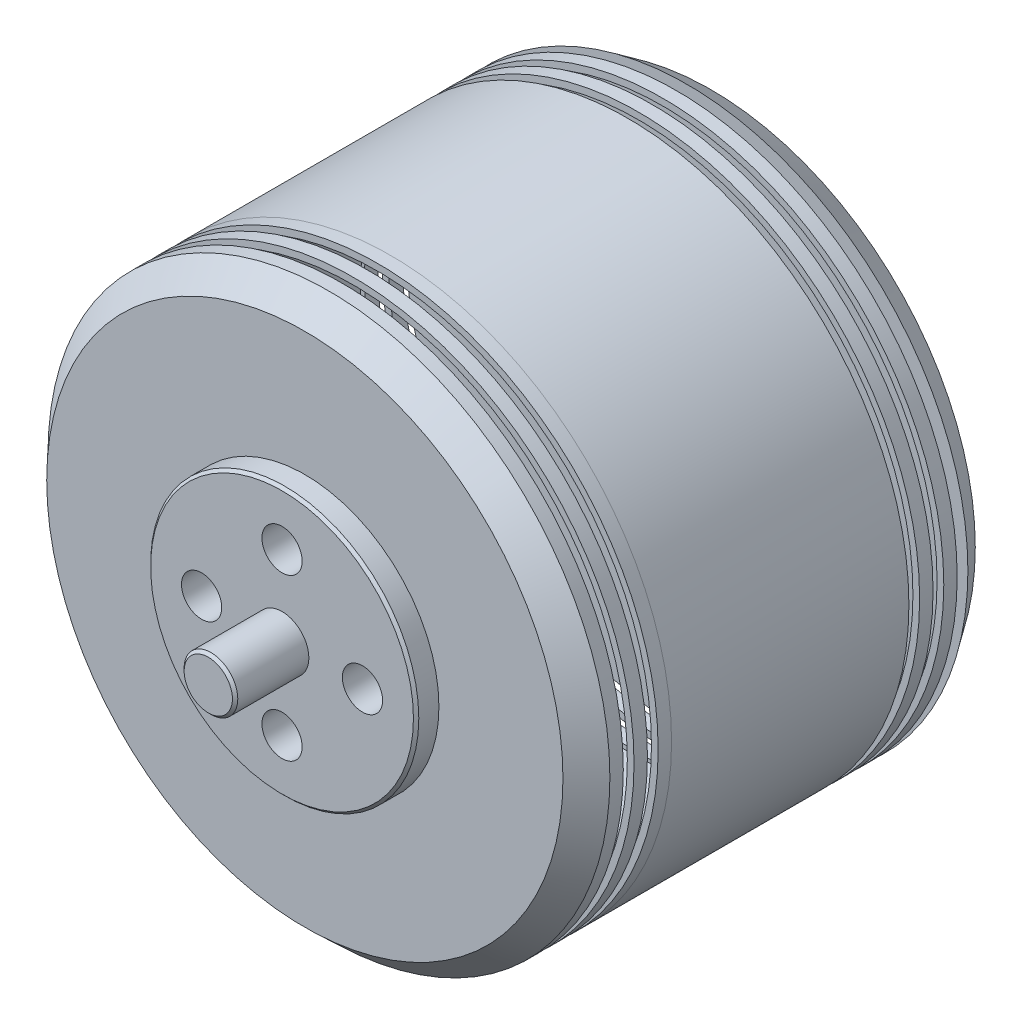
ISO-10303-21;
HEADER;
FILE_DESCRIPTION(('STEP AP214'),'2;1');
FILE_NAME('part.step','',(''),(''),'','','');
FILE_SCHEMA(('AUTOMOTIVE_DESIGN { 1 0 10303 214 1 1 1 1 }'));
ENDSEC;
DATA;
#1=APPLICATION_CONTEXT('core data for automotive mechanical design processes');
#2=APPLICATION_PROTOCOL_DEFINITION('international standard','automotive_design',2000,#1);
#3=PRODUCT_CONTEXT('',#1,'mechanical');
#4=PRODUCT('Part','Part','',(#3));
#5=PRODUCT_RELATED_PRODUCT_CATEGORY('part','',(#4));
#6=PRODUCT_DEFINITION_FORMATION('','',#4);
#7=PRODUCT_DEFINITION_CONTEXT('part definition',#1,'design');
#8=PRODUCT_DEFINITION('design','',#6,#7);
#9=PRODUCT_DEFINITION_SHAPE('','',#8);
#10=(LENGTH_UNIT() NAMED_UNIT(*) SI_UNIT(.MILLI.,.METRE.));
#11=(NAMED_UNIT(*) PLANE_ANGLE_UNIT() SI_UNIT($,.RADIAN.));
#12=(NAMED_UNIT(*) SI_UNIT($,.STERADIAN.) SOLID_ANGLE_UNIT());
#13=UNCERTAINTY_MEASURE_WITH_UNIT(LENGTH_MEASURE(1.E-05),#10,'distance_accuracy_value','');
#14=(GEOMETRIC_REPRESENTATION_CONTEXT(3) GLOBAL_UNCERTAINTY_ASSIGNED_CONTEXT((#13)) GLOBAL_UNIT_ASSIGNED_CONTEXT((#10,
#11,#12)) REPRESENTATION_CONTEXT('',''));
#15=CARTESIAN_POINT('',(0.,0.,0.));
#16=DIRECTION('',(0.,0.,1.));
#17=DIRECTION('',(1.,0.,0.));
#18=AXIS2_PLACEMENT_3D('',#15,#16,#17);
#19=CARTESIAN_POINT('',(0.,0.,27.5));
#20=DIRECTION('',(0.,0.,1.));
#21=DIRECTION('',(1.,0.,0.));
#22=AXIS2_PLACEMENT_3D('',#19,#20,#21);
#23=PLANE('',#22);
#24=CARTESIAN_POINT('',(0.,0.,27.5));
#25=DIRECTION('',(0.,0.,1.));
#26=DIRECTION('',(1.,0.,0.));
#27=AXIS2_PLACEMENT_3D('',#24,#25,#26);
#28=CIRCLE('',#27,20.95);
#29=CARTESIAN_POINT('',(20.95,0.,27.5));
#30=VERTEX_POINT('',#29);
#31=EDGE_CURVE('E84',#30,#30,#28,.T.);
#32=ORIENTED_EDGE('',*,*,#31,.F.);
#33=EDGE_LOOP('',(#32));
#34=FACE_BOUND('',#33,.T.);
#35=CARTESIAN_POINT('',(0.,0.,27.5));
#36=DIRECTION('',(0.,0.,1.));
#37=DIRECTION('',(1.,0.,0.));
#38=AXIS2_PLACEMENT_3D('',#35,#36,#37);
#39=CIRCLE('',#38,20.45);
#40=CARTESIAN_POINT('',(20.45,0.,27.5));
#41=VERTEX_POINT('',#40);
#42=EDGE_CURVE('E87',#41,#41,#39,.T.);
#43=ORIENTED_EDGE('',*,*,#42,.T.);
#44=EDGE_LOOP('',(#43));
#45=FACE_BOUND('',#44,.T.);
#46=ADVANCED_FACE('F52',(#34,#45),#23,.F.);
#47=CARTESIAN_POINT('',(0.,0.,28.5));
#48=DIRECTION('',(0.,0.,-1.));
#49=DIRECTION('',(-1.,0.,0.));
#50=AXIS2_PLACEMENT_3D('',#47,#48,#49);
#51=CYLINDRICAL_SURFACE('',#50,20.95);
#52=CARTESIAN_POINT('',(0.,0.,28.5));
#53=DIRECTION('',(0.,0.,-1.));
#54=DIRECTION('',(-1.,0.,0.));
#55=AXIS2_PLACEMENT_3D('',#52,#53,#54);
#56=CIRCLE('',#55,20.95);
#57=CARTESIAN_POINT('',(-20.95,0.,28.5));
#58=VERTEX_POINT('',#57);
#59=EDGE_CURVE('E80',#58,#58,#56,.F.);
#60=ORIENTED_EDGE('',*,*,#59,.F.);
#61=EDGE_LOOP('',(#60));
#62=FACE_BOUND('',#61,.T.);
#63=ORIENTED_EDGE('',*,*,#31,.T.);
#64=EDGE_LOOP('',(#63));
#65=FACE_BOUND('',#64,.T.);
#66=ADVANCED_FACE('F122',(#62,#65),#51,.T.);
#67=CARTESIAN_POINT('',(0.,0.,28.5));
#68=DIRECTION('',(0.,0.,-1.));
#69=DIRECTION('',(-1.,0.,0.));
#70=AXIS2_PLACEMENT_3D('',#67,#68,#69);
#71=CYLINDRICAL_SURFACE('',#70,20.45);
#72=CARTESIAN_POINT('',(0.,0.,28.5));
#73=DIRECTION('',(0.,0.,1.));
#74=DIRECTION('',(1.,0.,0.));
#75=AXIS2_PLACEMENT_3D('',#72,#73,#74);
#76=CIRCLE('',#75,20.45);
#77=CARTESIAN_POINT('',(20.45,0.,28.5));
#78=VERTEX_POINT('',#77);
#79=EDGE_CURVE('E90',#78,#78,#76,.T.);
#80=ORIENTED_EDGE('',*,*,#79,.T.);
#81=EDGE_LOOP('',(#80));
#82=FACE_BOUND('',#81,.T.);
#83=ORIENTED_EDGE('',*,*,#42,.F.);
#84=EDGE_LOOP('',(#83));
#85=FACE_BOUND('',#84,.T.);
#86=ADVANCED_FACE('F119',(#82,#85),#71,.F.);
#87=CARTESIAN_POINT('',(0.,0.,28.5));
#88=DIRECTION('',(0.,0.,1.));
#89=DIRECTION('',(1.,0.,0.));
#90=AXIS2_PLACEMENT_3D('',#87,#88,#89);
#91=PLANE('',#90);
#92=CARTESIAN_POINT('',(-6.,0.,28.5));
#93=DIRECTION('',(0.,0.,1.));
#94=DIRECTION('',(1.,0.,0.));
#95=AXIS2_PLACEMENT_3D('',#92,#93,#94);
#96=CIRCLE('',#95,1.49999999999999);
#97=CARTESIAN_POINT('',(-4.50000000000001,0.,28.5));
#98=VERTEX_POINT('',#97);
#99=EDGE_CURVE('E173',#98,#98,#96,.T.);
#100=ORIENTED_EDGE('',*,*,#99,.T.);
#101=EDGE_LOOP('',(#100));
#102=FACE_BOUND('',#101,.T.);
#103=CARTESIAN_POINT('',(6.,0.,28.5));
#104=DIRECTION('',(0.,0.,1.));
#105=DIRECTION('',(1.,0.,0.));
#106=AXIS2_PLACEMENT_3D('',#103,#104,#105);
#107=CIRCLE('',#106,1.49999999999999);
#108=CARTESIAN_POINT('',(7.49999999999999,0.,28.5));
#109=VERTEX_POINT('',#108);
#110=EDGE_CURVE('E177',#109,#109,#107,.T.);
#111=ORIENTED_EDGE('',*,*,#110,.T.);
#112=EDGE_LOOP('',(#111));
#113=FACE_BOUND('',#112,.T.);
#114=CARTESIAN_POINT('',(0.,-6.,28.5));
#115=DIRECTION('',(0.,0.,1.));
#116=DIRECTION('',(1.,0.,0.));
#117=AXIS2_PLACEMENT_3D('',#114,#115,#116);
#118=CIRCLE('',#117,1.49999999999999);
#119=CARTESIAN_POINT('',(1.49999999999999,-6.,28.5));
#120=VERTEX_POINT('',#119);
#121=EDGE_CURVE('E73',#120,#120,#118,.T.);
#122=ORIENTED_EDGE('',*,*,#121,.T.);
#123=EDGE_LOOP('',(#122));
#124=FACE_BOUND('',#123,.T.);
#125=CARTESIAN_POINT('',(0.,6.,28.5));
#126=DIRECTION('',(0.,0.,1.));
#127=DIRECTION('',(1.,0.,0.));
#128=AXIS2_PLACEMENT_3D('',#125,#126,#127);
#129=CIRCLE('',#128,1.49999999999999);
#130=CARTESIAN_POINT('',(1.49999999999999,6.,28.5));
#131=VERTEX_POINT('',#130);
#132=EDGE_CURVE('E98',#131,#131,#129,.T.);
#133=ORIENTED_EDGE('',*,*,#132,.T.);
#134=EDGE_LOOP('',(#133));
#135=FACE_BOUND('',#134,.T.);
#136=ORIENTED_EDGE('',*,*,#79,.F.);
#137=EDGE_LOOP('',(#136));
#138=FACE_BOUND('',#137,.T.);
#139=ADVANCED_FACE('F115',(#102,#113,#124,#135,#138),#91,.F.);
#140=CARTESIAN_POINT('',(0.,0.,30.3));
#141=DIRECTION('',(0.,0.,1.));
#142=DIRECTION('',(1.,0.,0.));
#143=AXIS2_PLACEMENT_3D('',#140,#141,#142);
#144=PLANE('',#143);
#145=CARTESIAN_POINT('',(0.,0.,30.3));
#146=DIRECTION('',(0.,0.,1.));
#147=DIRECTION('',(1.,0.,0.));
#148=AXIS2_PLACEMENT_3D('',#145,#146,#147);
#149=CIRCLE('',#148,10.);
#150=CARTESIAN_POINT('',(10.,0.,30.3));
#151=VERTEX_POINT('',#150);
#152=EDGE_CURVE('E83',#151,#151,#149,.T.);
#153=ORIENTED_EDGE('',*,*,#152,.F.);
#154=EDGE_LOOP('',(#153));
#155=FACE_BOUND('',#154,.T.);
#156=CARTESIAN_POINT('',(0.,0.,30.3));
#157=DIRECTION('',(0.,0.,1.));
#158=DIRECTION('',(1.,0.,0.));
#159=AXIS2_PLACEMENT_3D('',#156,#157,#158);
#160=CIRCLE('',#159,19.25);
#161=CARTESIAN_POINT('',(19.25,0.,30.3));
#162=VERTEX_POINT('',#161);
#163=EDGE_CURVE('E93',#162,#162,#160,.T.);
#164=ORIENTED_EDGE('',*,*,#163,.T.);
#165=EDGE_LOOP('',(#164));
#166=FACE_BOUND('',#165,.T.);
#167=ADVANCED_FACE('F104',(#155,#166),#144,.T.);
#168=CARTESIAN_POINT('',(0.,0.,30.3));
#169=DIRECTION('',(0.,0.,-1.));
#170=DIRECTION('',(-1.,0.,0.));
#171=AXIS2_PLACEMENT_3D('',#168,#169,#170);
#172=CONICAL_SURFACE('',#171,19.25,0.756834505558688);
#173=ORIENTED_EDGE('',*,*,#59,.T.);
#174=EDGE_LOOP('',(#173));
#175=FACE_BOUND('',#174,.T.);
#176=ORIENTED_EDGE('',*,*,#163,.F.);
#177=EDGE_LOOP('',(#176));
#178=FACE_BOUND('',#177,.T.);
#179=ADVANCED_FACE('F114',(#175,#178),#172,.T.);
#180=CARTESIAN_POINT('',(0.,0.,32.));
#181=DIRECTION('',(0.,0.,-1.));
#182=DIRECTION('',(-1.,0.,0.));
#183=AXIS2_PLACEMENT_3D('',#180,#181,#182);
#184=CYLINDRICAL_SURFACE('',#183,10.);
#185=CARTESIAN_POINT('',(0.,0.,31.8));
#186=DIRECTION('',(0.,0.,1.));
#187=DIRECTION('',(1.,0.,0.));
#188=AXIS2_PLACEMENT_3D('',#185,#186,#187);
#189=CIRCLE('',#188,10.);
#190=CARTESIAN_POINT('',(10.,0.,31.8));
#191=VERTEX_POINT('',#190);
#192=EDGE_CURVE('E12',#191,#191,#189,.F.);
#193=ORIENTED_EDGE('',*,*,#192,.T.);
#194=EDGE_LOOP('',(#193));
#195=FACE_BOUND('',#194,.T.);
#196=ORIENTED_EDGE('',*,*,#152,.T.);
#197=EDGE_LOOP('',(#196));
#198=FACE_BOUND('',#197,.T.);
#199=ADVANCED_FACE('F164',(#195,#198),#184,.T.);
#200=CARTESIAN_POINT('',(0.,0.,32.));
#201=DIRECTION('',(0.,0.,1.));
#202=DIRECTION('',(1.,0.,0.));
#203=AXIS2_PLACEMENT_3D('',#200,#201,#202);
#204=PLANE('',#203);
#205=CARTESIAN_POINT('',(0.,0.,32.));
#206=DIRECTION('',(0.,0.,1.));
#207=DIRECTION('',(1.,0.,0.));
#208=AXIS2_PLACEMENT_3D('',#205,#206,#207);
#209=CIRCLE('',#208,9.80000000000001);
#210=CARTESIAN_POINT('',(9.80000000000001,0.,32.));
#211=VERTEX_POINT('',#210);
#212=EDGE_CURVE('E59',#211,#211,#209,.T.);
#213=ORIENTED_EDGE('',*,*,#212,.T.);
#214=EDGE_LOOP('',(#213));
#215=FACE_BOUND('',#214,.T.);
#216=CARTESIAN_POINT('',(-6.,0.,32.));
#217=DIRECTION('',(0.,0.,1.));
#218=DIRECTION('',(1.,0.,0.));
#219=AXIS2_PLACEMENT_3D('',#216,#217,#218);
#220=CIRCLE('',#219,1.49999999999999);
#221=CARTESIAN_POINT('',(-4.50000000000001,0.,32.));
#222=VERTEX_POINT('',#221);
#223=EDGE_CURVE('E317',#222,#222,#220,.T.);
#224=ORIENTED_EDGE('',*,*,#223,.F.);
#225=EDGE_LOOP('',(#224));
#226=FACE_BOUND('',#225,.T.);
#227=CARTESIAN_POINT('',(6.,0.,32.));
#228=DIRECTION('',(0.,0.,1.));
#229=DIRECTION('',(1.,0.,0.));
#230=AXIS2_PLACEMENT_3D('',#227,#228,#229);
#231=CIRCLE('',#230,1.49999999999999);
#232=CARTESIAN_POINT('',(7.49999999999999,0.,32.));
#233=VERTEX_POINT('',#232);
#234=EDGE_CURVE('E311',#233,#233,#231,.T.);
#235=ORIENTED_EDGE('',*,*,#234,.F.);
#236=EDGE_LOOP('',(#235));
#237=FACE_BOUND('',#236,.T.);
#238=CARTESIAN_POINT('',(0.,-6.,32.));
#239=DIRECTION('',(0.,0.,1.));
#240=DIRECTION('',(1.,0.,0.));
#241=AXIS2_PLACEMENT_3D('',#238,#239,#240);
#242=CIRCLE('',#241,1.49999999999999);
#243=CARTESIAN_POINT('',(1.49999999999999,-6.,32.));
#244=VERTEX_POINT('',#243);
#245=EDGE_CURVE('E77',#244,#244,#242,.T.);
#246=ORIENTED_EDGE('',*,*,#245,.F.);
#247=EDGE_LOOP('',(#246));
#248=FACE_BOUND('',#247,.T.);
#249=CARTESIAN_POINT('',(0.,6.,32.));
#250=DIRECTION('',(0.,0.,1.));
#251=DIRECTION('',(1.,0.,0.));
#252=AXIS2_PLACEMENT_3D('',#249,#250,#251);
#253=CIRCLE('',#252,1.49999999999999);
#254=CARTESIAN_POINT('',(1.49999999999999,6.,32.));
#255=VERTEX_POINT('',#254);
#256=EDGE_CURVE('E76',#255,#255,#253,.T.);
#257=ORIENTED_EDGE('',*,*,#256,.F.);
#258=EDGE_LOOP('',(#257));
#259=FACE_BOUND('',#258,.T.);
#260=CARTESIAN_POINT('',(0.,0.,32.));
#261=DIRECTION('',(0.,0.,1.));
#262=DIRECTION('',(1.,0.,0.));
#263=AXIS2_PLACEMENT_3D('',#260,#261,#262);
#264=CIRCLE('',#263,2.);
#265=CARTESIAN_POINT('',(2.,0.,32.));
#266=VERTEX_POINT('',#265);
#267=EDGE_CURVE('E72',#266,#266,#264,.T.);
#268=ORIENTED_EDGE('',*,*,#267,.F.);
#269=EDGE_LOOP('',(#268));
#270=FACE_BOUND('',#269,.T.);
#271=ADVANCED_FACE('F157',(#215,#226,#237,#248,#259,#270),#204,.T.);
#272=CARTESIAN_POINT('',(0.,0.,37.5));
#273=DIRECTION('',(0.,0.,-1.));
#274=DIRECTION('',(-1.,0.,0.));
#275=AXIS2_PLACEMENT_3D('',#272,#273,#274);
#276=CYLINDRICAL_SURFACE('',#275,2.);
#277=CARTESIAN_POINT('',(0.,0.,37.3));
#278=DIRECTION('',(0.,0.,1.));
#279=DIRECTION('',(1.,0.,0.));
#280=AXIS2_PLACEMENT_3D('',#277,#278,#279);
#281=CIRCLE('',#280,2.);
#282=CARTESIAN_POINT('',(2.,0.,37.3));
#283=VERTEX_POINT('',#282);
#284=EDGE_CURVE('E63',#283,#283,#281,.F.);
#285=ORIENTED_EDGE('',*,*,#284,.T.);
#286=EDGE_LOOP('',(#285));
#287=FACE_BOUND('',#286,.T.);
#288=ORIENTED_EDGE('',*,*,#267,.T.);
#289=EDGE_LOOP('',(#288));
#290=FACE_BOUND('',#289,.T.);
#291=ADVANCED_FACE('F148',(#287,#290),#276,.T.);
#292=CARTESIAN_POINT('',(0.,0.,37.5));
#293=DIRECTION('',(0.,0.,1.));
#294=DIRECTION('',(1.,0.,0.));
#295=AXIS2_PLACEMENT_3D('',#292,#293,#294);
#296=PLANE('',#295);
#297=CARTESIAN_POINT('',(0.,0.,37.5));
#298=DIRECTION('',(0.,0.,1.));
#299=DIRECTION('',(1.,0.,0.));
#300=AXIS2_PLACEMENT_3D('',#297,#298,#299);
#301=CIRCLE('',#300,1.8);
#302=CARTESIAN_POINT('',(1.8,0.,37.5));
#303=VERTEX_POINT('',#302);
#304=EDGE_CURVE('E67',#303,#303,#301,.T.);
#305=ORIENTED_EDGE('',*,*,#304,.T.);
#306=EDGE_LOOP('',(#305));
#307=FACE_BOUND('',#306,.T.);
#308=ADVANCED_FACE('F145',(#307),#296,.T.);
#309=CARTESIAN_POINT('',(0.,6.,32.));
#310=DIRECTION('',(0.,0.,1.));
#311=DIRECTION('',(1.,0.,0.));
#312=AXIS2_PLACEMENT_3D('',#309,#310,#311);
#313=CYLINDRICAL_SURFACE('',#312,1.49999999999999);
#314=ORIENTED_EDGE('',*,*,#256,.T.);
#315=EDGE_LOOP('',(#314));
#316=FACE_BOUND('',#315,.T.);
#317=ORIENTED_EDGE('',*,*,#132,.F.);
#318=EDGE_LOOP('',(#317));
#319=FACE_BOUND('',#318,.T.);
#320=ADVANCED_FACE('F147',(#316,#319),#313,.F.);
#321=CARTESIAN_POINT('',(0.,-6.,32.));
#322=DIRECTION('',(0.,0.,1.));
#323=DIRECTION('',(1.,0.,0.));
#324=AXIS2_PLACEMENT_3D('',#321,#322,#323);
#325=CYLINDRICAL_SURFACE('',#324,1.49999999999999);
#326=ORIENTED_EDGE('',*,*,#245,.T.);
#327=EDGE_LOOP('',(#326));
#328=FACE_BOUND('',#327,.T.);
#329=ORIENTED_EDGE('',*,*,#121,.F.);
#330=EDGE_LOOP('',(#329));
#331=FACE_BOUND('',#330,.T.);
#332=ADVANCED_FACE('F154',(#328,#331),#325,.F.);
#333=CARTESIAN_POINT('',(6.,0.,32.));
#334=DIRECTION('',(0.,0.,1.));
#335=DIRECTION('',(1.,0.,0.));
#336=AXIS2_PLACEMENT_3D('',#333,#334,#335);
#337=CYLINDRICAL_SURFACE('',#336,1.49999999999999);
#338=ORIENTED_EDGE('',*,*,#234,.T.);
#339=EDGE_LOOP('',(#338));
#340=FACE_BOUND('',#339,.T.);
#341=ORIENTED_EDGE('',*,*,#110,.F.);
#342=EDGE_LOOP('',(#341));
#343=FACE_BOUND('',#342,.T.);
#344=ADVANCED_FACE('F138',(#340,#343),#337,.F.);
#345=CARTESIAN_POINT('',(-6.,0.,32.));
#346=DIRECTION('',(0.,0.,1.));
#347=DIRECTION('',(1.,0.,0.));
#348=AXIS2_PLACEMENT_3D('',#345,#346,#347);
#349=CYLINDRICAL_SURFACE('',#348,1.49999999999999);
#350=ORIENTED_EDGE('',*,*,#223,.T.);
#351=EDGE_LOOP('',(#350));
#352=FACE_BOUND('',#351,.T.);
#353=ORIENTED_EDGE('',*,*,#99,.F.);
#354=EDGE_LOOP('',(#353));
#355=FACE_BOUND('',#354,.T.);
#356=ADVANCED_FACE('F131',(#352,#355),#349,.F.);
#357=CARTESIAN_POINT('',(0.,0.,37.5));
#358=DIRECTION('',(0.,0.,-1.));
#359=DIRECTION('',(-1.,0.,0.));
#360=AXIS2_PLACEMENT_3D('',#357,#358,#359);
#361=CONICAL_SURFACE('',#360,1.8,0.785398163397444);
#362=ORIENTED_EDGE('',*,*,#284,.F.);
#363=EDGE_LOOP('',(#362));
#364=FACE_BOUND('',#363,.T.);
#365=ORIENTED_EDGE('',*,*,#304,.F.);
#366=EDGE_LOOP('',(#365));
#367=FACE_BOUND('',#366,.T.);
#368=ADVANCED_FACE('F129',(#364,#367),#361,.T.);
#369=CARTESIAN_POINT('',(0.,0.,32.));
#370=DIRECTION('',(0.,0.,-1.));
#371=DIRECTION('',(-1.,0.,0.));
#372=AXIS2_PLACEMENT_3D('',#369,#370,#371);
#373=CONICAL_SURFACE('',#372,9.80000000000001,0.785398163397444);
#374=ORIENTED_EDGE('',*,*,#192,.F.);
#375=EDGE_LOOP('',(#374));
#376=FACE_BOUND('',#375,.T.);
#377=ORIENTED_EDGE('',*,*,#212,.F.);
#378=EDGE_LOOP('',(#377));
#379=FACE_BOUND('',#378,.T.);
#380=ADVANCED_FACE('F54',(#376,#379),#373,.T.);
#381=CLOSED_SHELL('',(#46,#66,#86,#139,#167,#179,#199,#271,#291,#308,#320,#332,#344,#356,#368,#380));
#382=MANIFOLD_SOLID_BREP('B2',#381);
#383=CARTESIAN_POINT('',(0.,0.,26.7));
#384=DIRECTION('',(0.,0.,1.));
#385=DIRECTION('',(1.,0.,0.));
#386=AXIS2_PLACEMENT_3D('',#383,#384,#385);
#387=PLANE('',#386);
#388=CARTESIAN_POINT('',(0.,0.,26.7));
#389=DIRECTION('',(0.,0.,1.));
#390=DIRECTION('',(1.,0.,0.));
#391=AXIS2_PLACEMENT_3D('',#388,#389,#390);
#392=CIRCLE('',#391,20.95);
#393=CARTESIAN_POINT('',(20.95,0.,26.7));
#394=VERTEX_POINT('',#393);
#395=EDGE_CURVE('E51',#394,#394,#392,.T.);
#396=ORIENTED_EDGE('',*,*,#395,.T.);
#397=EDGE_LOOP('',(#396));
#398=FACE_BOUND('',#397,.T.);
#399=CARTESIAN_POINT('',(0.,0.,26.7));
#400=DIRECTION('',(0.,0.,1.));
#401=DIRECTION('',(1.,0.,0.));
#402=AXIS2_PLACEMENT_3D('',#399,#400,#401);
#403=CIRCLE('',#402,20.45);
#404=CARTESIAN_POINT('',(20.45,0.,26.7));
#405=VERTEX_POINT('',#404);
#406=EDGE_CURVE('E354',#405,#405,#403,.T.);
#407=ORIENTED_EDGE('',*,*,#406,.F.);
#408=EDGE_LOOP('',(#407));
#409=FACE_BOUND('',#408,.T.);
#410=ADVANCED_FACE('F343',(#398,#409),#387,.T.);
#411=CARTESIAN_POINT('',(0.,0.,25.7));
#412=DIRECTION('',(0.,0.,1.));
#413=DIRECTION('',(1.,0.,0.));
#414=AXIS2_PLACEMENT_3D('',#411,#412,#413);
#415=PLANE('',#414);
#416=CARTESIAN_POINT('',(0.,0.,25.7));
#417=DIRECTION('',(0.,0.,1.));
#418=DIRECTION('',(1.,0.,0.));
#419=AXIS2_PLACEMENT_3D('',#416,#417,#418);
#420=CIRCLE('',#419,20.95);
#421=CARTESIAN_POINT('',(20.95,0.,25.7));
#422=VERTEX_POINT('',#421);
#423=EDGE_CURVE('E347',#422,#422,#420,.T.);
#424=ORIENTED_EDGE('',*,*,#423,.F.);
#425=EDGE_LOOP('',(#424));
#426=FACE_BOUND('',#425,.T.);
#427=CARTESIAN_POINT('',(0.,0.,25.7));
#428=DIRECTION('',(0.,0.,1.));
#429=DIRECTION('',(1.,0.,0.));
#430=AXIS2_PLACEMENT_3D('',#427,#428,#429);
#431=CIRCLE('',#430,20.45);
#432=CARTESIAN_POINT('',(20.45,0.,25.7));
#433=VERTEX_POINT('',#432);
#434=EDGE_CURVE('E356',#433,#433,#431,.T.);
#435=ORIENTED_EDGE('',*,*,#434,.T.);
#436=EDGE_LOOP('',(#435));
#437=FACE_BOUND('',#436,.T.);
#438=ADVANCED_FACE('F366',(#426,#437),#415,.F.);
#439=CARTESIAN_POINT('',(0.,0.,26.7));
#440=DIRECTION('',(0.,0.,-1.));
#441=DIRECTION('',(-1.,0.,0.));
#442=AXIS2_PLACEMENT_3D('',#439,#440,#441);
#443=CYLINDRICAL_SURFACE('',#442,20.95);
#444=ORIENTED_EDGE('',*,*,#395,.F.);
#445=EDGE_LOOP('',(#444));
#446=FACE_BOUND('',#445,.T.);
#447=ORIENTED_EDGE('',*,*,#423,.T.);
#448=EDGE_LOOP('',(#447));
#449=FACE_BOUND('',#448,.T.);
#450=ADVANCED_FACE('F345',(#446,#449),#443,.T.);
#451=CARTESIAN_POINT('',(0.,0.,26.7));
#452=DIRECTION('',(0.,0.,-1.));
#453=DIRECTION('',(-1.,0.,0.));
#454=AXIS2_PLACEMENT_3D('',#451,#452,#453);
#455=CYLINDRICAL_SURFACE('',#454,20.45);
#456=ORIENTED_EDGE('',*,*,#406,.T.);
#457=EDGE_LOOP('',(#456));
#458=FACE_BOUND('',#457,.T.);
#459=ORIENTED_EDGE('',*,*,#434,.F.);
#460=EDGE_LOOP('',(#459));
#461=FACE_BOUND('',#460,.T.);
#462=ADVANCED_FACE('F362',(#458,#461),#455,.F.);
#463=CLOSED_SHELL('',(#410,#438,#450,#462));
#464=MANIFOLD_SOLID_BREP('B7',#463);
#465=CARTESIAN_POINT('',(0.,0.,24.9));
#466=DIRECTION('',(0.,0.,1.));
#467=DIRECTION('',(1.,0.,0.));
#468=AXIS2_PLACEMENT_3D('',#465,#466,#467);
#469=PLANE('',#468);
#470=CARTESIAN_POINT('',(0.,0.,24.9));
#471=DIRECTION('',(0.,0.,1.));
#472=DIRECTION('',(1.,0.,0.));
#473=AXIS2_PLACEMENT_3D('',#470,#471,#472);
#474=CIRCLE('',#473,20.95);
#475=CARTESIAN_POINT('',(20.95,0.,24.9));
#476=VERTEX_POINT('',#475);
#477=EDGE_CURVE('E342',#476,#476,#474,.T.);
#478=ORIENTED_EDGE('',*,*,#477,.T.);
#479=EDGE_LOOP('',(#478));
#480=FACE_BOUND('',#479,.T.);
#481=CARTESIAN_POINT('',(0.,0.,24.9));
#482=DIRECTION('',(0.,0.,1.));
#483=DIRECTION('',(1.,0.,0.));
#484=AXIS2_PLACEMENT_3D('',#481,#482,#483);
#485=CIRCLE('',#484,20.45);
#486=CARTESIAN_POINT('',(20.45,0.,24.9));
#487=VERTEX_POINT('',#486);
#488=EDGE_CURVE('E423',#487,#487,#485,.T.);
#489=ORIENTED_EDGE('',*,*,#488,.F.);
#490=EDGE_LOOP('',(#489));
#491=FACE_BOUND('',#490,.T.);
#492=ADVANCED_FACE('F412',(#480,#491),#469,.T.);
#493=CARTESIAN_POINT('',(0.,0.,23.9));
#494=DIRECTION('',(0.,0.,1.));
#495=DIRECTION('',(1.,0.,0.));
#496=AXIS2_PLACEMENT_3D('',#493,#494,#495);
#497=PLANE('',#496);
#498=CARTESIAN_POINT('',(0.,0.,23.9));
#499=DIRECTION('',(0.,0.,1.));
#500=DIRECTION('',(1.,0.,0.));
#501=AXIS2_PLACEMENT_3D('',#498,#499,#500);
#502=CIRCLE('',#501,20.95);
#503=CARTESIAN_POINT('',(20.95,0.,23.9));
#504=VERTEX_POINT('',#503);
#505=EDGE_CURVE('E416',#504,#504,#502,.T.);
#506=ORIENTED_EDGE('',*,*,#505,.F.);
#507=EDGE_LOOP('',(#506));
#508=FACE_BOUND('',#507,.T.);
#509=CARTESIAN_POINT('',(0.,0.,23.9));
#510=DIRECTION('',(0.,0.,1.));
#511=DIRECTION('',(1.,0.,0.));
#512=AXIS2_PLACEMENT_3D('',#509,#510,#511);
#513=CIRCLE('',#512,20.45);
#514=CARTESIAN_POINT('',(20.45,0.,23.9));
#515=VERTEX_POINT('',#514);
#516=EDGE_CURVE('E425',#515,#515,#513,.T.);
#517=ORIENTED_EDGE('',*,*,#516,.T.);
#518=EDGE_LOOP('',(#517));
#519=FACE_BOUND('',#518,.T.);
#520=ADVANCED_FACE('F435',(#508,#519),#497,.F.);
#521=CARTESIAN_POINT('',(0.,0.,24.9));
#522=DIRECTION('',(0.,0.,-1.));
#523=DIRECTION('',(-1.,0.,0.));
#524=AXIS2_PLACEMENT_3D('',#521,#522,#523);
#525=CYLINDRICAL_SURFACE('',#524,20.95);
#526=ORIENTED_EDGE('',*,*,#477,.F.);
#527=EDGE_LOOP('',(#526));
#528=FACE_BOUND('',#527,.T.);
#529=ORIENTED_EDGE('',*,*,#505,.T.);
#530=EDGE_LOOP('',(#529));
#531=FACE_BOUND('',#530,.T.);
#532=ADVANCED_FACE('F414',(#528,#531),#525,.T.);
#533=CARTESIAN_POINT('',(0.,0.,24.9));
#534=DIRECTION('',(0.,0.,-1.));
#535=DIRECTION('',(-1.,0.,0.));
#536=AXIS2_PLACEMENT_3D('',#533,#534,#535);
#537=CYLINDRICAL_SURFACE('',#536,20.45);
#538=ORIENTED_EDGE('',*,*,#488,.T.);
#539=EDGE_LOOP('',(#538));
#540=FACE_BOUND('',#539,.T.);
#541=ORIENTED_EDGE('',*,*,#516,.F.);
#542=EDGE_LOOP('',(#541));
#543=FACE_BOUND('',#542,.T.);
#544=ADVANCED_FACE('F431',(#540,#543),#537,.F.);
#545=CLOSED_SHELL('',(#492,#520,#532,#544));
#546=MANIFOLD_SOLID_BREP('B46',#545);
#547=CARTESIAN_POINT('',(0.,0.,23.9));
#548=DIRECTION('',(0.,0.,1.));
#549=DIRECTION('',(1.,0.,0.));
#550=AXIS2_PLACEMENT_3D('',#547,#548,#549);
#551=PLANE('',#550);
#552=CARTESIAN_POINT('',(0.,0.,23.9));
#553=DIRECTION('',(0.,0.,1.));
#554=DIRECTION('',(1.,0.,0.));
#555=AXIS2_PLACEMENT_3D('',#552,#553,#554);
#556=CIRCLE('',#555,20.95);
#557=CARTESIAN_POINT('',(20.95,0.,23.9));
#558=VERTEX_POINT('',#557);
#559=EDGE_CURVE('E411',#558,#558,#556,.T.);
#560=ORIENTED_EDGE('',*,*,#559,.T.);
#561=EDGE_LOOP('',(#560));
#562=FACE_BOUND('',#561,.T.);
#563=CARTESIAN_POINT('',(0.,0.,23.9));
#564=DIRECTION('',(0.,0.,1.));
#565=DIRECTION('',(1.,0.,0.));
#566=AXIS2_PLACEMENT_3D('',#563,#564,#565);
#567=CIRCLE('',#566,19.95);
#568=CARTESIAN_POINT('',(19.95,0.,23.9));
#569=VERTEX_POINT('',#568);
#570=EDGE_CURVE('E493',#569,#569,#567,.T.);
#571=ORIENTED_EDGE('',*,*,#570,.F.);
#572=EDGE_LOOP('',(#571));
#573=FACE_BOUND('',#572,.T.);
#574=ADVANCED_FACE('F482',(#562,#573),#551,.T.);
#575=CARTESIAN_POINT('',(0.,0.,6.2));
#576=DIRECTION('',(0.,0.,1.));
#577=DIRECTION('',(1.,0.,0.));
#578=AXIS2_PLACEMENT_3D('',#575,#576,#577);
#579=PLANE('',#578);
#580=CARTESIAN_POINT('',(0.,0.,6.2));
#581=DIRECTION('',(0.,0.,1.));
#582=DIRECTION('',(1.,0.,0.));
#583=AXIS2_PLACEMENT_3D('',#580,#581,#582);
#584=CIRCLE('',#583,20.95);
#585=CARTESIAN_POINT('',(20.95,0.,6.2));
#586=VERTEX_POINT('',#585);
#587=EDGE_CURVE('E486',#586,#586,#584,.T.);
#588=ORIENTED_EDGE('',*,*,#587,.F.);
#589=EDGE_LOOP('',(#588));
#590=FACE_BOUND('',#589,.T.);
#591=CARTESIAN_POINT('',(0.,0.,6.2));
#592=DIRECTION('',(0.,0.,1.));
#593=DIRECTION('',(1.,0.,0.));
#594=AXIS2_PLACEMENT_3D('',#591,#592,#593);
#595=CIRCLE('',#594,19.95);
#596=CARTESIAN_POINT('',(19.95,0.,6.2));
#597=VERTEX_POINT('',#596);
#598=EDGE_CURVE('E495',#597,#597,#595,.T.);
#599=ORIENTED_EDGE('',*,*,#598,.T.);
#600=EDGE_LOOP('',(#599));
#601=FACE_BOUND('',#600,.T.);
#602=ADVANCED_FACE('F505',(#590,#601),#579,.F.);
#603=CARTESIAN_POINT('',(0.,0.,23.9));
#604=DIRECTION('',(0.,0.,-1.));
#605=DIRECTION('',(-1.,0.,0.));
#606=AXIS2_PLACEMENT_3D('',#603,#604,#605);
#607=CYLINDRICAL_SURFACE('',#606,20.95);
#608=ORIENTED_EDGE('',*,*,#559,.F.);
#609=EDGE_LOOP('',(#608));
#610=FACE_BOUND('',#609,.T.);
#611=ORIENTED_EDGE('',*,*,#587,.T.);
#612=EDGE_LOOP('',(#611));
#613=FACE_BOUND('',#612,.T.);
#614=ADVANCED_FACE('F484',(#610,#613),#607,.T.);
#615=CARTESIAN_POINT('',(0.,0.,23.9));
#616=DIRECTION('',(0.,0.,-1.));
#617=DIRECTION('',(-1.,0.,0.));
#618=AXIS2_PLACEMENT_3D('',#615,#616,#617);
#619=CYLINDRICAL_SURFACE('',#618,19.95);
#620=ORIENTED_EDGE('',*,*,#570,.T.);
#621=EDGE_LOOP('',(#620));
#622=FACE_BOUND('',#621,.T.);
#623=ORIENTED_EDGE('',*,*,#598,.F.);
#624=EDGE_LOOP('',(#623));
#625=FACE_BOUND('',#624,.T.);
#626=ADVANCED_FACE('F501',(#622,#625),#619,.F.);
#627=CLOSED_SHELL('',(#574,#602,#614,#626));
#628=MANIFOLD_SOLID_BREP('B337',#627);
#629=CARTESIAN_POINT('',(0.,0.,5.4));
#630=DIRECTION('',(0.,0.,1.));
#631=DIRECTION('',(1.,0.,0.));
#632=AXIS2_PLACEMENT_3D('',#629,#630,#631);
#633=PLANE('',#632);
#634=CARTESIAN_POINT('',(0.,0.,5.4));
#635=DIRECTION('',(0.,0.,1.));
#636=DIRECTION('',(1.,0.,0.));
#637=AXIS2_PLACEMENT_3D('',#634,#635,#636);
#638=CIRCLE('',#637,20.95);
#639=CARTESIAN_POINT('',(20.95,0.,5.4));
#640=VERTEX_POINT('',#639);
#641=EDGE_CURVE('E481',#640,#640,#638,.T.);
#642=ORIENTED_EDGE('',*,*,#641,.T.);
#643=EDGE_LOOP('',(#642));
#644=FACE_BOUND('',#643,.T.);
#645=CARTESIAN_POINT('',(0.,0.,5.4));
#646=DIRECTION('',(0.,0.,1.));
#647=DIRECTION('',(1.,0.,0.));
#648=AXIS2_PLACEMENT_3D('',#645,#646,#647);
#649=CIRCLE('',#648,20.45);
#650=CARTESIAN_POINT('',(20.45,0.,5.4));
#651=VERTEX_POINT('',#650);
#652=EDGE_CURVE('E562',#651,#651,#649,.T.);
#653=ORIENTED_EDGE('',*,*,#652,.F.);
#654=EDGE_LOOP('',(#653));
#655=FACE_BOUND('',#654,.T.);
#656=ADVANCED_FACE('F551',(#644,#655),#633,.T.);
#657=CARTESIAN_POINT('',(0.,0.,4.4));
#658=DIRECTION('',(0.,0.,1.));
#659=DIRECTION('',(1.,0.,0.));
#660=AXIS2_PLACEMENT_3D('',#657,#658,#659);
#661=PLANE('',#660);
#662=CARTESIAN_POINT('',(0.,0.,4.4));
#663=DIRECTION('',(0.,0.,1.));
#664=DIRECTION('',(1.,0.,0.));
#665=AXIS2_PLACEMENT_3D('',#662,#663,#664);
#666=CIRCLE('',#665,20.95);
#667=CARTESIAN_POINT('',(20.95,0.,4.4));
#668=VERTEX_POINT('',#667);
#669=EDGE_CURVE('E555',#668,#668,#666,.T.);
#670=ORIENTED_EDGE('',*,*,#669,.F.);
#671=EDGE_LOOP('',(#670));
#672=FACE_BOUND('',#671,.T.);
#673=CARTESIAN_POINT('',(0.,0.,4.4));
#674=DIRECTION('',(0.,0.,1.));
#675=DIRECTION('',(1.,0.,0.));
#676=AXIS2_PLACEMENT_3D('',#673,#674,#675);
#677=CIRCLE('',#676,20.45);
#678=CARTESIAN_POINT('',(20.45,0.,4.4));
#679=VERTEX_POINT('',#678);
#680=EDGE_CURVE('E564',#679,#679,#677,.T.);
#681=ORIENTED_EDGE('',*,*,#680,.T.);
#682=EDGE_LOOP('',(#681));
#683=FACE_BOUND('',#682,.T.);
#684=ADVANCED_FACE('F574',(#672,#683),#661,.F.);
#685=CARTESIAN_POINT('',(0.,0.,5.4));
#686=DIRECTION('',(0.,0.,-1.));
#687=DIRECTION('',(-1.,0.,0.));
#688=AXIS2_PLACEMENT_3D('',#685,#686,#687);
#689=CYLINDRICAL_SURFACE('',#688,20.95);
#690=ORIENTED_EDGE('',*,*,#641,.F.);
#691=EDGE_LOOP('',(#690));
#692=FACE_BOUND('',#691,.T.);
#693=ORIENTED_EDGE('',*,*,#669,.T.);
#694=EDGE_LOOP('',(#693));
#695=FACE_BOUND('',#694,.T.);
#696=ADVANCED_FACE('F553',(#692,#695),#689,.T.);
#697=CARTESIAN_POINT('',(0.,0.,5.4));
#698=DIRECTION('',(0.,0.,-1.));
#699=DIRECTION('',(-1.,0.,0.));
#700=AXIS2_PLACEMENT_3D('',#697,#698,#699);
#701=CYLINDRICAL_SURFACE('',#700,20.45);
#702=ORIENTED_EDGE('',*,*,#652,.T.);
#703=EDGE_LOOP('',(#702));
#704=FACE_BOUND('',#703,.T.);
#705=ORIENTED_EDGE('',*,*,#680,.F.);
#706=EDGE_LOOP('',(#705));
#707=FACE_BOUND('',#706,.T.);
#708=ADVANCED_FACE('F570',(#704,#707),#701,.F.);
#709=CLOSED_SHELL('',(#656,#684,#696,#708));
#710=MANIFOLD_SOLID_BREP('B406',#709);
#711=CARTESIAN_POINT('',(0.,0.,3.6));
#712=DIRECTION('',(0.,0.,1.));
#713=DIRECTION('',(1.,0.,0.));
#714=AXIS2_PLACEMENT_3D('',#711,#712,#713);
#715=PLANE('',#714);
#716=CARTESIAN_POINT('',(0.,0.,3.6));
#717=DIRECTION('',(0.,0.,1.));
#718=DIRECTION('',(1.,0.,0.));
#719=AXIS2_PLACEMENT_3D('',#716,#717,#718);
#720=CIRCLE('',#719,20.95);
#721=CARTESIAN_POINT('',(20.95,0.,3.6));
#722=VERTEX_POINT('',#721);
#723=EDGE_CURVE('E550',#722,#722,#720,.T.);
#724=ORIENTED_EDGE('',*,*,#723,.T.);
#725=EDGE_LOOP('',(#724));
#726=FACE_BOUND('',#725,.T.);
#727=CARTESIAN_POINT('',(0.,0.,3.6));
#728=DIRECTION('',(0.,0.,1.));
#729=DIRECTION('',(1.,0.,0.));
#730=AXIS2_PLACEMENT_3D('',#727,#728,#729);
#731=CIRCLE('',#730,20.45);
#732=CARTESIAN_POINT('',(20.45,0.,3.6));
#733=VERTEX_POINT('',#732);
#734=EDGE_CURVE('E630',#733,#733,#731,.T.);
#735=ORIENTED_EDGE('',*,*,#734,.F.);
#736=EDGE_LOOP('',(#735));
#737=FACE_BOUND('',#736,.T.);
#738=ADVANCED_FACE('F619',(#726,#737),#715,.T.);
#739=CARTESIAN_POINT('',(0.,0.,2.6));
#740=DIRECTION('',(0.,0.,1.));
#741=DIRECTION('',(1.,0.,0.));
#742=AXIS2_PLACEMENT_3D('',#739,#740,#741);
#743=PLANE('',#742);
#744=CARTESIAN_POINT('',(0.,0.,2.6));
#745=DIRECTION('',(0.,0.,1.));
#746=DIRECTION('',(1.,0.,0.));
#747=AXIS2_PLACEMENT_3D('',#744,#745,#746);
#748=CIRCLE('',#747,20.95);
#749=CARTESIAN_POINT('',(20.95,0.,2.6));
#750=VERTEX_POINT('',#749);
#751=EDGE_CURVE('E623',#750,#750,#748,.T.);
#752=ORIENTED_EDGE('',*,*,#751,.F.);
#753=EDGE_LOOP('',(#752));
#754=FACE_BOUND('',#753,.T.);
#755=CARTESIAN_POINT('',(0.,0.,2.6));
#756=DIRECTION('',(0.,0.,1.));
#757=DIRECTION('',(1.,0.,0.));
#758=AXIS2_PLACEMENT_3D('',#755,#756,#757);
#759=CIRCLE('',#758,20.45);
#760=CARTESIAN_POINT('',(20.45,0.,2.6));
#761=VERTEX_POINT('',#760);
#762=EDGE_CURVE('E632',#761,#761,#759,.T.);
#763=ORIENTED_EDGE('',*,*,#762,.T.);
#764=EDGE_LOOP('',(#763));
#765=FACE_BOUND('',#764,.T.);
#766=ADVANCED_FACE('F642',(#754,#765),#743,.F.);
#767=CARTESIAN_POINT('',(0.,0.,3.6));
#768=DIRECTION('',(0.,0.,-1.));
#769=DIRECTION('',(-1.,0.,0.));
#770=AXIS2_PLACEMENT_3D('',#767,#768,#769);
#771=CYLINDRICAL_SURFACE('',#770,20.95);
#772=ORIENTED_EDGE('',*,*,#723,.F.);
#773=EDGE_LOOP('',(#772));
#774=FACE_BOUND('',#773,.T.);
#775=ORIENTED_EDGE('',*,*,#751,.T.);
#776=EDGE_LOOP('',(#775));
#777=FACE_BOUND('',#776,.T.);
#778=ADVANCED_FACE('F621',(#774,#777),#771,.T.);
#779=CARTESIAN_POINT('',(0.,0.,3.6));
#780=DIRECTION('',(0.,0.,-1.));
#781=DIRECTION('',(-1.,0.,0.));
#782=AXIS2_PLACEMENT_3D('',#779,#780,#781);
#783=CYLINDRICAL_SURFACE('',#782,20.45);
#784=ORIENTED_EDGE('',*,*,#734,.T.);
#785=EDGE_LOOP('',(#784));
#786=FACE_BOUND('',#785,.T.);
#787=ORIENTED_EDGE('',*,*,#762,.F.);
#788=EDGE_LOOP('',(#787));
#789=FACE_BOUND('',#788,.T.);
#790=ADVANCED_FACE('F638',(#786,#789),#783,.F.);
#791=CLOSED_SHELL('',(#738,#766,#778,#790));
#792=MANIFOLD_SOLID_BREP('B476',#791);
#793=CARTESIAN_POINT('',(0.,0.,0.));
#794=DIRECTION('',(0.,0.,1.));
#795=DIRECTION('',(1.,0.,0.));
#796=AXIS2_PLACEMENT_3D('',#793,#794,#795);
#797=PLANE('',#796);
#798=CARTESIAN_POINT('',(12.5,0.,0.));
#799=DIRECTION('',(0.,0.,-1.));
#800=DIRECTION('',(-1.,0.,0.));
#801=AXIS2_PLACEMENT_3D('',#798,#799,#800);
#802=CIRCLE('',#801,1.49999999999999);
#803=CARTESIAN_POINT('',(11.,0.,0.));
#804=VERTEX_POINT('',#803);
#805=EDGE_CURVE('E836',#804,#804,#802,.T.);
#806=ORIENTED_EDGE('',*,*,#805,.F.);
#807=EDGE_LOOP('',(#806));
#808=FACE_BOUND('',#807,.T.);
#809=CARTESIAN_POINT('',(0.,12.5,0.));
#810=DIRECTION('',(0.,0.,-1.));
#811=DIRECTION('',(-1.,0.,0.));
#812=AXIS2_PLACEMENT_3D('',#809,#810,#811);
#813=CIRCLE('',#812,1.49999999999999);
#814=CARTESIAN_POINT('',(-1.49999999999999,12.5,0.));
#815=VERTEX_POINT('',#814);
#816=EDGE_CURVE('E714',#815,#815,#813,.T.);
#817=ORIENTED_EDGE('',*,*,#816,.F.);
#818=EDGE_LOOP('',(#817));
#819=FACE_BOUND('',#818,.T.);
#820=CARTESIAN_POINT('',(0.,-12.5,0.));
#821=DIRECTION('',(0.,0.,-1.));
#822=DIRECTION('',(-1.,0.,0.));
#823=AXIS2_PLACEMENT_3D('',#820,#821,#822);
#824=CIRCLE('',#823,1.49999999999999);
#825=CARTESIAN_POINT('',(-1.49999999999999,-12.5,0.));
#826=VERTEX_POINT('',#825);
#827=EDGE_CURVE('E704',#826,#826,#824,.T.);
#828=ORIENTED_EDGE('',*,*,#827,.F.);
#829=EDGE_LOOP('',(#828));
#830=FACE_BOUND('',#829,.T.);
#831=CARTESIAN_POINT('',(0.,0.,0.));
#832=DIRECTION('',(0.,0.,-1.));
#833=DIRECTION('',(-1.,0.,0.));
#834=AXIS2_PLACEMENT_3D('',#831,#832,#833);
#835=CIRCLE('',#834,6.9);
#836=CARTESIAN_POINT('',(-6.9,0.,0.));
#837=VERTEX_POINT('',#836);
#838=EDGE_CURVE('E720',#837,#837,#835,.T.);
#839=ORIENTED_EDGE('',*,*,#838,.F.);
#840=EDGE_LOOP('',(#839));
#841=FACE_BOUND('',#840,.T.);
#842=CARTESIAN_POINT('',(0.,0.,0.));
#843=DIRECTION('',(0.,0.,1.));
#844=DIRECTION('',(1.,0.,0.));
#845=AXIS2_PLACEMENT_3D('',#842,#843,#844);
#846=CIRCLE('',#845,19.7);
#847=CARTESIAN_POINT('',(19.7,0.,0.));
#848=VERTEX_POINT('',#847);
#849=EDGE_CURVE('E694',#848,#848,#846,.T.);
#850=ORIENTED_EDGE('',*,*,#849,.F.);
#851=EDGE_LOOP('',(#850));
#852=FACE_BOUND('',#851,.T.);
#853=CARTESIAN_POINT('',(-12.5,0.,0.));
#854=DIRECTION('',(0.,0.,-1.));
#855=DIRECTION('',(-1.,0.,0.));
#856=AXIS2_PLACEMENT_3D('',#853,#854,#855);
#857=CIRCLE('',#856,1.49999999999999);
#858=CARTESIAN_POINT('',(-14.,0.,0.));
#859=VERTEX_POINT('',#858);
#860=EDGE_CURVE('E701',#859,#859,#857,.T.);
#861=ORIENTED_EDGE('',*,*,#860,.F.);
#862=EDGE_LOOP('',(#861));
#863=FACE_BOUND('',#862,.T.);
#864=ADVANCED_FACE('F681',(#808,#819,#830,#841,#852,#863),#797,.F.);
#865=CARTESIAN_POINT('',(0.,0.,5.5));
#866=DIRECTION('',(0.,0.,-1.));
#867=DIRECTION('',(-1.,0.,0.));
#868=AXIS2_PLACEMENT_3D('',#865,#866,#867);
#869=CYLINDRICAL_SURFACE('',#868,6.9);
#870=ORIENTED_EDGE('',*,*,#838,.T.);
#871=EDGE_LOOP('',(#870));
#872=FACE_BOUND('',#871,.T.);
#873=CARTESIAN_POINT('',(0.,0.,0.8));
#874=DIRECTION('',(0.,0.,1.));
#875=DIRECTION('',(1.,0.,0.));
#876=AXIS2_PLACEMENT_3D('',#873,#874,#875);
#877=CIRCLE('',#876,6.9);
#878=CARTESIAN_POINT('',(6.9,0.,0.8));
#879=VERTEX_POINT('',#878);
#880=EDGE_CURVE('E689',#879,#879,#877,.F.);
#881=ORIENTED_EDGE('',*,*,#880,.F.);
#882=EDGE_LOOP('',(#881));
#883=FACE_BOUND('',#882,.T.);
#884=ADVANCED_FACE('F783',(#872,#883),#869,.F.);
#885=CARTESIAN_POINT('',(0.,0.,1.8));
#886=DIRECTION('',(0.,0.,1.));
#887=DIRECTION('',(1.,0.,0.));
#888=AXIS2_PLACEMENT_3D('',#885,#886,#887);
#889=PLANE('',#888);
#890=CARTESIAN_POINT('',(12.5,0.,1.8));
#891=DIRECTION('',(0.,0.,1.));
#892=DIRECTION('',(1.,0.,0.));
#893=AXIS2_PLACEMENT_3D('',#890,#891,#892);
#894=CIRCLE('',#893,1.49999999999999);
#895=CARTESIAN_POINT('',(14.,0.,1.8));
#896=VERTEX_POINT('',#895);
#897=EDGE_CURVE('E824',#896,#896,#894,.T.);
#898=ORIENTED_EDGE('',*,*,#897,.F.);
#899=EDGE_LOOP('',(#898));
#900=FACE_BOUND('',#899,.T.);
#901=CARTESIAN_POINT('',(0.,12.5,1.8));
#902=DIRECTION('',(0.,0.,1.));
#903=DIRECTION('',(1.,0.,0.));
#904=AXIS2_PLACEMENT_3D('',#901,#902,#903);
#905=CIRCLE('',#904,1.49999999999999);
#906=CARTESIAN_POINT('',(1.49999999999999,12.5,1.8));
#907=VERTEX_POINT('',#906);
#908=EDGE_CURVE('E685',#907,#907,#905,.T.);
#909=ORIENTED_EDGE('',*,*,#908,.F.);
#910=EDGE_LOOP('',(#909));
#911=FACE_BOUND('',#910,.T.);
#912=CARTESIAN_POINT('',(0.,-12.5,1.8));
#913=DIRECTION('',(0.,0.,1.));
#914=DIRECTION('',(1.,0.,0.));
#915=AXIS2_PLACEMENT_3D('',#912,#913,#914);
#916=CIRCLE('',#915,1.49999999999999);
#917=CARTESIAN_POINT('',(1.49999999999999,-12.5,1.8));
#918=VERTEX_POINT('',#917);
#919=EDGE_CURVE('E702',#918,#918,#916,.T.);
#920=ORIENTED_EDGE('',*,*,#919,.F.);
#921=EDGE_LOOP('',(#920));
#922=FACE_BOUND('',#921,.T.);
#923=CARTESIAN_POINT('',(-12.5,0.,1.8));
#924=DIRECTION('',(0.,0.,1.));
#925=DIRECTION('',(1.,0.,0.));
#926=AXIS2_PLACEMENT_3D('',#923,#924,#925);
#927=CIRCLE('',#926,1.49999999999999);
#928=CARTESIAN_POINT('',(-11.,0.,1.8));
#929=VERTEX_POINT('',#928);
#930=EDGE_CURVE('E698',#929,#929,#927,.T.);
#931=ORIENTED_EDGE('',*,*,#930,.F.);
#932=EDGE_LOOP('',(#931));
#933=FACE_BOUND('',#932,.T.);
#934=CARTESIAN_POINT('',(0.,0.,1.8));
#935=DIRECTION('',(0.,0.,1.));
#936=DIRECTION('',(1.,0.,0.));
#937=AXIS2_PLACEMENT_3D('',#934,#935,#936);
#938=CIRCLE('',#937,20.95);
#939=CARTESIAN_POINT('',(20.95,0.,1.8));
#940=VERTEX_POINT('',#939);
#941=EDGE_CURVE('E723',#940,#940,#938,.T.);
#942=ORIENTED_EDGE('',*,*,#941,.T.);
#943=EDGE_LOOP('',(#942));
#944=FACE_BOUND('',#943,.T.);
#945=ADVANCED_FACE('F743',(#900,#911,#922,#933,#944),#889,.T.);
#946=CARTESIAN_POINT('',(0.,0.,0.));
#947=DIRECTION('',(0.,0.,1.));
#948=DIRECTION('',(1.,0.,0.));
#949=AXIS2_PLACEMENT_3D('',#946,#947,#948);
#950=CONICAL_SURFACE('',#949,19.7,0.606987664046408);
#951=ORIENTED_EDGE('',*,*,#941,.F.);
#952=EDGE_LOOP('',(#951));
#953=FACE_BOUND('',#952,.T.);
#954=ORIENTED_EDGE('',*,*,#849,.T.);
#955=EDGE_LOOP('',(#954));
#956=FACE_BOUND('',#955,.T.);
#957=ADVANCED_FACE('F733',(#953,#956),#950,.T.);
#958=CARTESIAN_POINT('',(0.,0.,0.8));
#959=DIRECTION('',(0.,0.,1.));
#960=DIRECTION('',(1.,0.,0.));
#961=AXIS2_PLACEMENT_3D('',#958,#959,#960);
#962=PLANE('',#961);
#963=CARTESIAN_POINT('',(0.,0.,0.8));
#964=DIRECTION('',(0.,0.,1.));
#965=DIRECTION('',(1.,0.,0.));
#966=AXIS2_PLACEMENT_3D('',#963,#964,#965);
#967=CIRCLE('',#966,4.5);
#968=CARTESIAN_POINT('',(4.5,0.,0.8));
#969=VERTEX_POINT('',#968);
#970=EDGE_CURVE('E618',#969,#969,#967,.F.);
#971=ORIENTED_EDGE('',*,*,#970,.F.);
#972=EDGE_LOOP('',(#971));
#973=FACE_BOUND('',#972,.T.);
#974=ORIENTED_EDGE('',*,*,#880,.T.);
#975=EDGE_LOOP('',(#974));
#976=FACE_BOUND('',#975,.T.);
#977=ADVANCED_FACE('F742',(#973,#976),#962,.F.);
#978=CARTESIAN_POINT('',(0.,0.,-12.7279220613579));
#979=DIRECTION('',(0.,0.,1.));
#980=DIRECTION('',(1.,0.,0.));
#981=AXIS2_PLACEMENT_3D('',#978,#979,#980);
#982=CYLINDRICAL_SURFACE('',#981,4.5);
#983=ORIENTED_EDGE('',*,*,#970,.T.);
#984=EDGE_LOOP('',(#983));
#985=FACE_BOUND('',#984,.T.);
#986=CARTESIAN_POINT('',(0.,0.,-2.));
#987=DIRECTION('',(0.,0.,-1.));
#988=DIRECTION('',(-1.,0.,0.));
#989=AXIS2_PLACEMENT_3D('',#986,#987,#988);
#990=CIRCLE('',#989,4.5);
#991=CARTESIAN_POINT('',(-4.5,0.,-2.));
#992=VERTEX_POINT('',#991);
#993=EDGE_CURVE('E700',#992,#992,#990,.T.);
#994=ORIENTED_EDGE('',*,*,#993,.F.);
#995=EDGE_LOOP('',(#994));
#996=FACE_BOUND('',#995,.T.);
#997=ADVANCED_FACE('F799',(#985,#996),#982,.T.);
#998=CARTESIAN_POINT('',(0.,0.,-2.));
#999=DIRECTION('',(0.,0.,-1.));
#1000=DIRECTION('',(-1.,0.,0.));
#1001=AXIS2_PLACEMENT_3D('',#998,#999,#1000);
#1002=PLANE('',#1001);
#1003=ORIENTED_EDGE('',*,*,#993,.T.);
#1004=EDGE_LOOP('',(#1003));
#1005=FACE_BOUND('',#1004,.T.);
#1006=ADVANCED_FACE('F790',(#1005),#1002,.T.);
#1007=CARTESIAN_POINT('',(-12.5,0.,0.));
#1008=DIRECTION('',(0.,0.,-1.));
#1009=DIRECTION('',(-1.,0.,0.));
#1010=AXIS2_PLACEMENT_3D('',#1007,#1008,#1009);
#1011=CYLINDRICAL_SURFACE('',#1010,1.49999999999999);
#1012=ORIENTED_EDGE('',*,*,#930,.T.);
#1013=EDGE_LOOP('',(#1012));
#1014=FACE_BOUND('',#1013,.T.);
#1015=ORIENTED_EDGE('',*,*,#860,.T.);
#1016=EDGE_LOOP('',(#1015));
#1017=FACE_BOUND('',#1016,.T.);
#1018=ADVANCED_FACE('F787',(#1014,#1017),#1011,.F.);
#1019=CARTESIAN_POINT('',(0.,-12.5,0.));
#1020=DIRECTION('',(0.,0.,-1.));
#1021=DIRECTION('',(-1.,0.,0.));
#1022=AXIS2_PLACEMENT_3D('',#1019,#1020,#1021);
#1023=CYLINDRICAL_SURFACE('',#1022,1.49999999999999);
#1024=ORIENTED_EDGE('',*,*,#919,.T.);
#1025=EDGE_LOOP('',(#1024));
#1026=FACE_BOUND('',#1025,.T.);
#1027=ORIENTED_EDGE('',*,*,#827,.T.);
#1028=EDGE_LOOP('',(#1027));
#1029=FACE_BOUND('',#1028,.T.);
#1030=ADVANCED_FACE('F789',(#1026,#1029),#1023,.F.);
#1031=CARTESIAN_POINT('',(0.,12.5,0.));
#1032=DIRECTION('',(0.,0.,-1.));
#1033=DIRECTION('',(-1.,0.,0.));
#1034=AXIS2_PLACEMENT_3D('',#1031,#1032,#1033);
#1035=CYLINDRICAL_SURFACE('',#1034,1.49999999999999);
#1036=ORIENTED_EDGE('',*,*,#908,.T.);
#1037=EDGE_LOOP('',(#1036));
#1038=FACE_BOUND('',#1037,.T.);
#1039=ORIENTED_EDGE('',*,*,#816,.T.);
#1040=EDGE_LOOP('',(#1039));
#1041=FACE_BOUND('',#1040,.T.);
#1042=ADVANCED_FACE('F797',(#1038,#1041),#1035,.F.);
#1043=CARTESIAN_POINT('',(12.5,0.,0.));
#1044=DIRECTION('',(0.,0.,-1.));
#1045=DIRECTION('',(-1.,0.,0.));
#1046=AXIS2_PLACEMENT_3D('',#1043,#1044,#1045);
#1047=CYLINDRICAL_SURFACE('',#1046,1.49999999999999);
#1048=ORIENTED_EDGE('',*,*,#897,.T.);
#1049=EDGE_LOOP('',(#1048));
#1050=FACE_BOUND('',#1049,.T.);
#1051=ORIENTED_EDGE('',*,*,#805,.T.);
#1052=EDGE_LOOP('',(#1051));
#1053=FACE_BOUND('',#1052,.T.);
#1054=ADVANCED_FACE('F832',(#1050,#1053),#1047,.F.);
#1055=CLOSED_SHELL('',(#864,#884,#945,#957,#977,#997,#1006,#1018,#1030,#1042,#1054));
#1056=MANIFOLD_SOLID_BREP('B545',#1055);
#1057=ADVANCED_BREP_SHAPE_REPRESENTATION('',(#18,#382,#464,#546,#628,#710,#792,#1056),#14);
#1058=SHAPE_DEFINITION_REPRESENTATION(#9,#1057);
ENDSEC;
END-ISO-10303-21;
